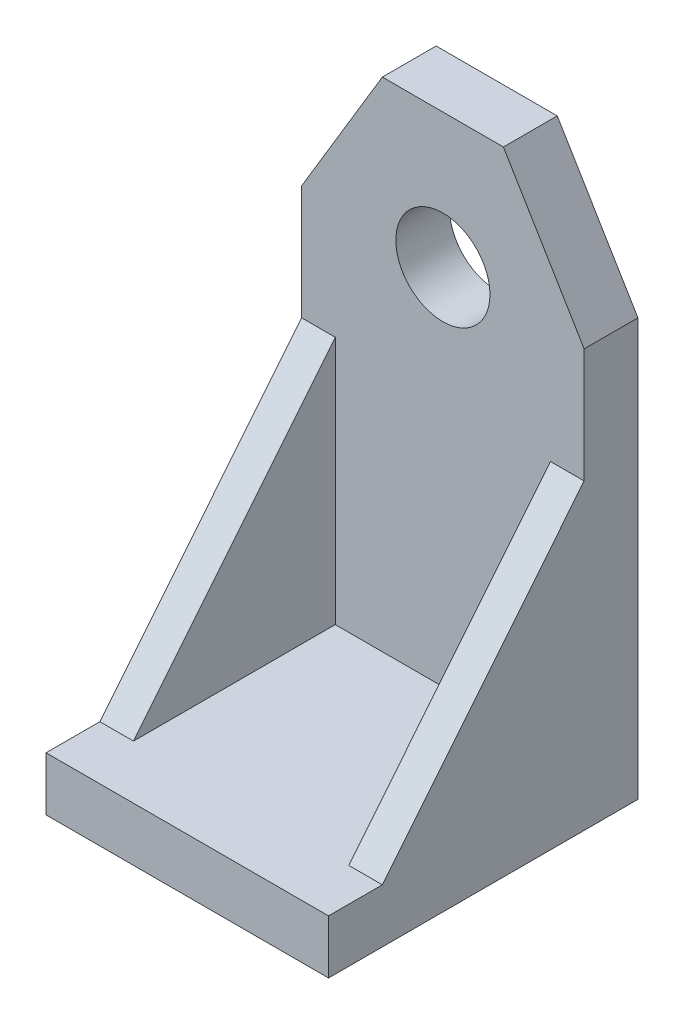
ISO-10303-21;
HEADER;
FILE_DESCRIPTION(('STEP AP214'),'2;1');
FILE_NAME('part.step','',(''),(''),'','','');
FILE_SCHEMA(('AUTOMOTIVE_DESIGN { 1 0 10303 214 1 1 1 1 }'));
ENDSEC;
DATA;
#1=APPLICATION_CONTEXT('core data for automotive mechanical design processes');
#2=APPLICATION_PROTOCOL_DEFINITION('international standard','automotive_design',2000,#1);
#3=PRODUCT_CONTEXT('',#1,'mechanical');
#4=PRODUCT('Part','Part','',(#3));
#5=PRODUCT_RELATED_PRODUCT_CATEGORY('part','',(#4));
#6=PRODUCT_DEFINITION_FORMATION('','',#4);
#7=PRODUCT_DEFINITION_CONTEXT('part definition',#1,'design');
#8=PRODUCT_DEFINITION('design','',#6,#7);
#9=PRODUCT_DEFINITION_SHAPE('','',#8);
#10=(LENGTH_UNIT() NAMED_UNIT(*) SI_UNIT(.MILLI.,.METRE.));
#11=(NAMED_UNIT(*) PLANE_ANGLE_UNIT() SI_UNIT($,.RADIAN.));
#12=(NAMED_UNIT(*) SI_UNIT($,.STERADIAN.) SOLID_ANGLE_UNIT());
#13=UNCERTAINTY_MEASURE_WITH_UNIT(LENGTH_MEASURE(1.E-05),#10,'distance_accuracy_value','');
#14=(GEOMETRIC_REPRESENTATION_CONTEXT(3) GLOBAL_UNCERTAINTY_ASSIGNED_CONTEXT((#13)) GLOBAL_UNIT_ASSIGNED_CONTEXT((#10,
#11,#12)) REPRESENTATION_CONTEXT('',''));
#15=CARTESIAN_POINT('',(0.,0.,0.));
#16=DIRECTION('',(0.,0.,1.));
#17=DIRECTION('',(1.,0.,0.));
#18=AXIS2_PLACEMENT_3D('',#15,#16,#17);
#19=CARTESIAN_POINT('',(0.,8.,23.));
#20=DIRECTION('',(0.,-1.,0.));
#21=DIRECTION('',(0.,0.,-1.));
#22=AXIS2_PLACEMENT_3D('',#19,#20,#21);
#23=PLANE('',#22);
#24=DIRECTION('',(0.,0.,-1.));
#25=VECTOR('',#24,1.);
#26=CARTESIAN_POINT('',(42.,8.,23.));
#27=LINE('',#26,#25);
#28=CARTESIAN_POINT('',(42.,8.,23.));
#29=VERTEX_POINT('',#28);
#30=CARTESIAN_POINT('',(42.,8.,15.));
#31=VERTEX_POINT('',#30);
#32=EDGE_CURVE('E167',#29,#31,#27,.T.);
#33=ORIENTED_EDGE('',*,*,#32,.T.);
#34=DIRECTION('',(1.,0.,0.));
#35=VECTOR('',#34,1.);
#36=CARTESIAN_POINT('',(37.,8.,15.));
#37=LINE('',#36,#35);
#38=CARTESIAN_POINT('',(37.,8.,15.));
#39=VERTEX_POINT('',#38);
#40=EDGE_CURVE('E54',#39,#31,#37,.T.);
#41=ORIENTED_EDGE('',*,*,#40,.F.);
#42=DIRECTION('',(0.,0.,-1.));
#43=VECTOR('',#42,1.);
#44=CARTESIAN_POINT('',(37.,8.,15.));
#45=LINE('',#44,#43);
#46=CARTESIAN_POINT('',(37.,8.,-15.));
#47=VERTEX_POINT('',#46);
#48=EDGE_CURVE('E274',#39,#47,#45,.T.);
#49=ORIENTED_EDGE('',*,*,#48,.T.);
#50=DIRECTION('',(1.,0.,0.));
#51=VECTOR('',#50,1.);
#52=CARTESIAN_POINT('',(42.,8.,-15.));
#53=LINE('',#52,#51);
#54=CARTESIAN_POINT('',(5.00000000000001,8.,-15.));
#55=VERTEX_POINT('',#54);
#56=EDGE_CURVE('E194',#55,#47,#53,.T.);
#57=ORIENTED_EDGE('',*,*,#56,.F.);
#58=DIRECTION('',(0.,0.,-1.));
#59=VECTOR('',#58,1.);
#60=CARTESIAN_POINT('',(5.,8.,15.));
#61=LINE('',#60,#59);
#62=CARTESIAN_POINT('',(5.,8.,15.));
#63=VERTEX_POINT('',#62);
#64=EDGE_CURVE('E288',#63,#55,#61,.T.);
#65=ORIENTED_EDGE('',*,*,#64,.F.);
#66=DIRECTION('',(-1.,0.,0.));
#67=VECTOR('',#66,1.);
#68=CARTESIAN_POINT('',(5.,8.,15.));
#69=LINE('',#68,#67);
#70=CARTESIAN_POINT('',(0.,8.,15.));
#71=VERTEX_POINT('',#70);
#72=EDGE_CURVE('E207',#63,#71,#69,.T.);
#73=ORIENTED_EDGE('',*,*,#72,.T.);
#74=DIRECTION('',(0.,0.,-1.));
#75=VECTOR('',#74,1.);
#76=CARTESIAN_POINT('',(0.,8.,23.));
#77=LINE('',#76,#75);
#78=CARTESIAN_POINT('',(0.,8.,23.));
#79=VERTEX_POINT('',#78);
#80=EDGE_CURVE('E164',#79,#71,#77,.T.);
#81=ORIENTED_EDGE('',*,*,#80,.F.);
#82=DIRECTION('',(-1.,0.,0.));
#83=VECTOR('',#82,1.);
#84=CARTESIAN_POINT('',(0.,8.,23.));
#85=LINE('',#84,#83);
#86=EDGE_CURVE('E158',#29,#79,#85,.T.);
#87=ORIENTED_EDGE('',*,*,#86,.F.);
#88=EDGE_LOOP('',(#33,#41,#49,#57,#65,#73,#81,#87));
#89=FACE_BOUND('',#88,.T.);
#90=ADVANCED_FACE('F39',(#89),#23,.F.);
#91=CARTESIAN_POINT('',(42.,82.,-15.));
#92=DIRECTION('',(0.,0.,-1.));
#93=DIRECTION('',(-1.,0.,0.));
#94=AXIS2_PLACEMENT_3D('',#91,#92,#93);
#95=PLANE('',#94);
#96=CARTESIAN_POINT('',(21.,62.,-15.));
#97=DIRECTION('',(0.,0.,1.));
#98=DIRECTION('',(1.,0.,0.));
#99=AXIS2_PLACEMENT_3D('',#96,#97,#98);
#100=CIRCLE('',#99,7.);
#101=CARTESIAN_POINT('',(28.,62.,-15.));
#102=VERTEX_POINT('',#101);
#103=EDGE_CURVE('E266',#102,#102,#100,.T.);
#104=ORIENTED_EDGE('',*,*,#103,.F.);
#105=EDGE_LOOP('',(#104));
#106=FACE_BOUND('',#105,.T.);
#107=DIRECTION('',(0.,1.,0.));
#108=VECTOR('',#107,1.);
#109=CARTESIAN_POINT('',(37.,8.,-15.));
#110=LINE('',#109,#108);
#111=CARTESIAN_POINT('',(37.,45.,-15.));
#112=VERTEX_POINT('',#111);
#113=EDGE_CURVE('E62',#47,#112,#110,.T.);
#114=ORIENTED_EDGE('',*,*,#113,.T.);
#115=DIRECTION('',(1.,0.,0.));
#116=VECTOR('',#115,1.);
#117=CARTESIAN_POINT('',(37.,45.,-15.));
#118=LINE('',#117,#116);
#119=CARTESIAN_POINT('',(42.,45.0000000000001,-15.));
#120=VERTEX_POINT('',#119);
#121=EDGE_CURVE('E276',#112,#120,#118,.T.);
#122=ORIENTED_EDGE('',*,*,#121,.T.);
#123=DIRECTION('',(0.,-1.,0.));
#124=VECTOR('',#123,1.);
#125=CARTESIAN_POINT('',(42.,82.,-15.));
#126=LINE('',#125,#124);
#127=CARTESIAN_POINT('',(42.,62.,-15.));
#128=VERTEX_POINT('',#127);
#129=EDGE_CURVE('E155',#128,#120,#126,.T.);
#130=ORIENTED_EDGE('',*,*,#129,.F.);
#131=DIRECTION('',(0.514495755427527,-0.857492925712544,0.));
#132=VECTOR('',#131,1.);
#133=CARTESIAN_POINT('',(42.,62.,-15.));
#134=LINE('',#133,#132);
#135=CARTESIAN_POINT('',(30.,82.,-15.));
#136=VERTEX_POINT('',#135);
#137=EDGE_CURVE('E183',#136,#128,#134,.T.);
#138=ORIENTED_EDGE('',*,*,#137,.F.);
#139=DIRECTION('',(1.,0.,0.));
#140=VECTOR('',#139,1.);
#141=CARTESIAN_POINT('',(42.,82.,-15.));
#142=LINE('',#141,#140);
#143=CARTESIAN_POINT('',(12.,82.,-15.));
#144=VERTEX_POINT('',#143);
#145=EDGE_CURVE('E191',#144,#136,#142,.T.);
#146=ORIENTED_EDGE('',*,*,#145,.F.);
#147=DIRECTION('',(0.514495755427527,0.857492925712544,0.));
#148=VECTOR('',#147,1.);
#149=CARTESIAN_POINT('',(12.,82.,-15.));
#150=LINE('',#149,#148);
#151=CARTESIAN_POINT('',(0.,62.,-15.));
#152=VERTEX_POINT('',#151);
#153=EDGE_CURVE('E139',#152,#144,#150,.T.);
#154=ORIENTED_EDGE('',*,*,#153,.F.);
#155=DIRECTION('',(0.,-1.,0.));
#156=VECTOR('',#155,1.);
#157=CARTESIAN_POINT('',(0.,82.,-15.));
#158=LINE('',#157,#156);
#159=CARTESIAN_POINT('',(0.,45.,-15.));
#160=VERTEX_POINT('',#159);
#161=EDGE_CURVE('E147',#152,#160,#158,.T.);
#162=ORIENTED_EDGE('',*,*,#161,.T.);
#163=DIRECTION('',(-1.,0.,0.));
#164=VECTOR('',#163,1.);
#165=CARTESIAN_POINT('',(5.,45.,-15.));
#166=LINE('',#165,#164);
#167=CARTESIAN_POINT('',(5.,45.,-15.));
#168=VERTEX_POINT('',#167);
#169=EDGE_CURVE('E293',#168,#160,#166,.T.);
#170=ORIENTED_EDGE('',*,*,#169,.F.);
#171=DIRECTION('',(0.,1.,0.));
#172=VECTOR('',#171,1.);
#173=CARTESIAN_POINT('',(5.,8.,-15.));
#174=LINE('',#173,#172);
#175=EDGE_CURVE('E282',#55,#168,#174,.T.);
#176=ORIENTED_EDGE('',*,*,#175,.F.);
#177=ORIENTED_EDGE('',*,*,#56,.T.);
#178=EDGE_LOOP('',(#114,#122,#130,#138,#146,#154,#162,#170,#176,#177));
#179=FACE_BOUND('',#178,.T.);
#180=ADVANCED_FACE('F216',(#106,#179),#95,.F.);
#181=CARTESIAN_POINT('',(0.,0.,23.));
#182=DIRECTION('',(1.,0.,0.));
#183=DIRECTION('',(0.,0.,-1.));
#184=AXIS2_PLACEMENT_3D('',#181,#182,#183);
#185=PLANE('',#184);
#186=ORIENTED_EDGE('',*,*,#161,.F.);
#187=DIRECTION('',(0.,0.,1.));
#188=VECTOR('',#187,1.);
#189=CARTESIAN_POINT('',(0.,62.,-23.));
#190=LINE('',#189,#188);
#191=CARTESIAN_POINT('',(0.,62.,-23.));
#192=VERTEX_POINT('',#191);
#193=EDGE_CURVE('E131',#192,#152,#190,.T.);
#194=ORIENTED_EDGE('',*,*,#193,.F.);
#195=DIRECTION('',(0.,-1.,0.));
#196=VECTOR('',#195,1.);
#197=CARTESIAN_POINT('',(0.,0.,-23.));
#198=LINE('',#197,#196);
#199=CARTESIAN_POINT('',(0.,0.,-23.));
#200=VERTEX_POINT('',#199);
#201=EDGE_CURVE('E144',#192,#200,#198,.T.);
#202=ORIENTED_EDGE('',*,*,#201,.T.);
#203=DIRECTION('',(0.,0.,-1.));
#204=VECTOR('',#203,1.);
#205=CARTESIAN_POINT('',(0.,0.,23.));
#206=LINE('',#205,#204);
#207=CARTESIAN_POINT('',(0.,0.,23.));
#208=VERTEX_POINT('',#207);
#209=EDGE_CURVE('E11',#208,#200,#206,.T.);
#210=ORIENTED_EDGE('',*,*,#209,.F.);
#211=DIRECTION('',(0.,-1.,0.));
#212=VECTOR('',#211,1.);
#213=CARTESIAN_POINT('',(0.,0.,23.));
#214=LINE('',#213,#212);
#215=EDGE_CURVE('E163',#79,#208,#214,.T.);
#216=ORIENTED_EDGE('',*,*,#215,.F.);
#217=ORIENTED_EDGE('',*,*,#80,.T.);
#218=DIRECTION('',(0.,-0.776755748719504,0.629801958421219));
#219=VECTOR('',#218,1.);
#220=CARTESIAN_POINT('',(0.,45.,-15.));
#221=LINE('',#220,#219);
#222=EDGE_CURVE('E280',#160,#71,#221,.T.);
#223=ORIENTED_EDGE('',*,*,#222,.F.);
#224=EDGE_LOOP('',(#186,#194,#202,#210,#216,#217,#223));
#225=FACE_BOUND('',#224,.T.);
#226=ADVANCED_FACE('F41',(#225),#185,.F.);
#227=CARTESIAN_POINT('',(0.,0.,23.));
#228=DIRECTION('',(0.,1.,0.));
#229=DIRECTION('',(0.,0.,1.));
#230=AXIS2_PLACEMENT_3D('',#227,#228,#229);
#231=PLANE('',#230);
#232=DIRECTION('',(1.,0.,0.));
#233=VECTOR('',#232,1.);
#234=CARTESIAN_POINT('',(0.,0.,-23.));
#235=LINE('',#234,#233);
#236=CARTESIAN_POINT('',(42.,0.,-23.));
#237=VERTEX_POINT('',#236);
#238=EDGE_CURVE('E151',#200,#237,#235,.T.);
#239=ORIENTED_EDGE('',*,*,#238,.T.);
#240=DIRECTION('',(0.,0.,-1.));
#241=VECTOR('',#240,1.);
#242=CARTESIAN_POINT('',(42.,0.,23.));
#243=LINE('',#242,#241);
#244=CARTESIAN_POINT('',(42.,0.,23.));
#245=VERTEX_POINT('',#244);
#246=EDGE_CURVE('E47',#245,#237,#243,.T.);
#247=ORIENTED_EDGE('',*,*,#246,.F.);
#248=DIRECTION('',(1.,0.,0.));
#249=VECTOR('',#248,1.);
#250=CARTESIAN_POINT('',(0.,0.,23.));
#251=LINE('',#250,#249);
#252=EDGE_CURVE('E200',#208,#245,#251,.T.);
#253=ORIENTED_EDGE('',*,*,#252,.F.);
#254=ORIENTED_EDGE('',*,*,#209,.T.);
#255=EDGE_LOOP('',(#239,#247,#253,#254));
#256=FACE_BOUND('',#255,.T.);
#257=ADVANCED_FACE('F209',(#256),#231,.F.);
#258=CARTESIAN_POINT('',(42.,0.,23.));
#259=DIRECTION('',(-1.,0.,0.));
#260=DIRECTION('',(0.,0.,1.));
#261=AXIS2_PLACEMENT_3D('',#258,#259,#260);
#262=PLANE('',#261);
#263=ORIENTED_EDGE('',*,*,#129,.T.);
#264=DIRECTION('',(0.,-0.776755748719504,0.629801958421219));
#265=VECTOR('',#264,1.);
#266=CARTESIAN_POINT('',(42.,45.,-15.));
#267=LINE('',#266,#265);
#268=EDGE_CURVE('E268',#120,#31,#267,.T.);
#269=ORIENTED_EDGE('',*,*,#268,.T.);
#270=ORIENTED_EDGE('',*,*,#32,.F.);
#271=DIRECTION('',(0.,1.,0.));
#272=VECTOR('',#271,1.);
#273=CARTESIAN_POINT('',(42.,0.,23.));
#274=LINE('',#273,#272);
#275=EDGE_CURVE('E176',#245,#29,#274,.T.);
#276=ORIENTED_EDGE('',*,*,#275,.F.);
#277=ORIENTED_EDGE('',*,*,#246,.T.);
#278=DIRECTION('',(0.,1.,0.));
#279=VECTOR('',#278,1.);
#280=CARTESIAN_POINT('',(42.,0.,-23.));
#281=LINE('',#280,#279);
#282=CARTESIAN_POINT('',(42.,62.,-23.));
#283=VERTEX_POINT('',#282);
#284=EDGE_CURVE('E153',#237,#283,#281,.T.);
#285=ORIENTED_EDGE('',*,*,#284,.T.);
#286=DIRECTION('',(0.,0.,1.));
#287=VECTOR('',#286,1.);
#288=CARTESIAN_POINT('',(42.,62.,-23.));
#289=LINE('',#288,#287);
#290=EDGE_CURVE('E184',#283,#128,#289,.T.);
#291=ORIENTED_EDGE('',*,*,#290,.T.);
#292=EDGE_LOOP('',(#263,#269,#270,#276,#277,#285,#291));
#293=FACE_BOUND('',#292,.T.);
#294=ADVANCED_FACE('F173',(#293),#262,.F.);
#295=CARTESIAN_POINT('',(0.,0.,23.));
#296=DIRECTION('',(0.,0.,-1.));
#297=DIRECTION('',(-1.,0.,0.));
#298=AXIS2_PLACEMENT_3D('',#295,#296,#297);
#299=PLANE('',#298);
#300=ORIENTED_EDGE('',*,*,#215,.T.);
#301=ORIENTED_EDGE('',*,*,#252,.T.);
#302=ORIENTED_EDGE('',*,*,#275,.T.);
#303=ORIENTED_EDGE('',*,*,#86,.T.);
#304=EDGE_LOOP('',(#300,#301,#302,#303));
#305=FACE_BOUND('',#304,.T.);
#306=ADVANCED_FACE('F204',(#305),#299,.F.);
#307=CARTESIAN_POINT('',(0.,0.,-23.));
#308=DIRECTION('',(0.,0.,-1.));
#309=DIRECTION('',(-1.,0.,0.));
#310=AXIS2_PLACEMENT_3D('',#307,#308,#309);
#311=PLANE('',#310);
#312=CARTESIAN_POINT('',(21.,62.,-23.));
#313=DIRECTION('',(0.,0.,1.));
#314=DIRECTION('',(1.,0.,0.));
#315=AXIS2_PLACEMENT_3D('',#312,#313,#314);
#316=CIRCLE('',#315,7.);
#317=CARTESIAN_POINT('',(28.,62.,-23.));
#318=VERTEX_POINT('',#317);
#319=EDGE_CURVE('E263',#318,#318,#316,.T.);
#320=ORIENTED_EDGE('',*,*,#319,.T.);
#321=EDGE_LOOP('',(#320));
#322=FACE_BOUND('',#321,.T.);
#323=DIRECTION('',(0.514495755427527,0.857492925712544,0.));
#324=VECTOR('',#323,1.);
#325=CARTESIAN_POINT('',(12.,82.,-23.));
#326=LINE('',#325,#324);
#327=CARTESIAN_POINT('',(12.,82.,-23.));
#328=VERTEX_POINT('',#327);
#329=EDGE_CURVE('E128',#192,#328,#326,.T.);
#330=ORIENTED_EDGE('',*,*,#329,.T.);
#331=DIRECTION('',(-1.,0.,0.));
#332=VECTOR('',#331,1.);
#333=CARTESIAN_POINT('',(0.,82.,-23.));
#334=LINE('',#333,#332);
#335=CARTESIAN_POINT('',(30.,82.,-23.));
#336=VERTEX_POINT('',#335);
#337=EDGE_CURVE('E180',#336,#328,#334,.T.);
#338=ORIENTED_EDGE('',*,*,#337,.F.);
#339=DIRECTION('',(0.514495755427527,-0.857492925712544,0.));
#340=VECTOR('',#339,1.);
#341=CARTESIAN_POINT('',(42.,62.,-23.));
#342=LINE('',#341,#340);
#343=EDGE_CURVE('E179',#336,#283,#342,.T.);
#344=ORIENTED_EDGE('',*,*,#343,.T.);
#345=ORIENTED_EDGE('',*,*,#284,.F.);
#346=ORIENTED_EDGE('',*,*,#238,.F.);
#347=ORIENTED_EDGE('',*,*,#201,.F.);
#348=EDGE_LOOP('',(#330,#338,#344,#345,#346,#347));
#349=FACE_BOUND('',#348,.T.);
#350=ADVANCED_FACE('F149',(#322,#349),#311,.T.);
#351=CARTESIAN_POINT('',(0.,82.,0.));
#352=DIRECTION('',(0.,-1.,0.));
#353=DIRECTION('',(0.,0.,-1.));
#354=AXIS2_PLACEMENT_3D('',#351,#352,#353);
#355=PLANE('',#354);
#356=ORIENTED_EDGE('',*,*,#337,.T.);
#357=DIRECTION('',(0.,0.,1.));
#358=VECTOR('',#357,1.);
#359=CARTESIAN_POINT('',(12.,82.,-23.));
#360=LINE('',#359,#358);
#361=EDGE_CURVE('E134',#328,#144,#360,.T.);
#362=ORIENTED_EDGE('',*,*,#361,.T.);
#363=ORIENTED_EDGE('',*,*,#145,.T.);
#364=DIRECTION('',(0.,0.,1.));
#365=VECTOR('',#364,1.);
#366=CARTESIAN_POINT('',(30.,82.,-23.));
#367=LINE('',#366,#365);
#368=EDGE_CURVE('E187',#336,#136,#367,.T.);
#369=ORIENTED_EDGE('',*,*,#368,.F.);
#370=EDGE_LOOP('',(#356,#362,#363,#369));
#371=FACE_BOUND('',#370,.T.);
#372=ADVANCED_FACE('F227',(#371),#355,.F.);
#373=CARTESIAN_POINT('',(42.,62.,-23.));
#374=DIRECTION('',(-0.857492925712544,-0.514495755427527,0.));
#375=DIRECTION('',(0.514495755427527,-0.857492925712544,0.));
#376=AXIS2_PLACEMENT_3D('',#373,#374,#375);
#377=PLANE('',#376);
#378=ORIENTED_EDGE('',*,*,#137,.T.);
#379=ORIENTED_EDGE('',*,*,#290,.F.);
#380=ORIENTED_EDGE('',*,*,#343,.F.);
#381=ORIENTED_EDGE('',*,*,#368,.T.);
#382=EDGE_LOOP('',(#378,#379,#380,#381));
#383=FACE_BOUND('',#382,.T.);
#384=ADVANCED_FACE('F233',(#383),#377,.F.);
#385=CARTESIAN_POINT('',(12.,82.,-23.));
#386=DIRECTION('',(0.857492925712544,-0.514495755427527,0.));
#387=DIRECTION('',(0.514495755427527,0.857492925712544,0.));
#388=AXIS2_PLACEMENT_3D('',#385,#386,#387);
#389=PLANE('',#388);
#390=ORIENTED_EDGE('',*,*,#153,.T.);
#391=ORIENTED_EDGE('',*,*,#361,.F.);
#392=ORIENTED_EDGE('',*,*,#329,.F.);
#393=ORIENTED_EDGE('',*,*,#193,.T.);
#394=EDGE_LOOP('',(#390,#391,#392,#393));
#395=FACE_BOUND('',#394,.T.);
#396=ADVANCED_FACE('F130',(#395),#389,.F.);
#397=CARTESIAN_POINT('',(5.,45.,-15.));
#398=DIRECTION('',(0.,-0.629801958421219,-0.776755748719504));
#399=DIRECTION('',(0.,0.776755748719504,-0.629801958421219));
#400=AXIS2_PLACEMENT_3D('',#397,#398,#399);
#401=PLANE('',#400);
#402=ORIENTED_EDGE('',*,*,#222,.T.);
#403=ORIENTED_EDGE('',*,*,#72,.F.);
#404=DIRECTION('',(0.,-0.776755748719504,0.629801958421219));
#405=VECTOR('',#404,1.);
#406=CARTESIAN_POINT('',(5.,45.,-15.));
#407=LINE('',#406,#405);
#408=EDGE_CURVE('E285',#168,#63,#407,.T.);
#409=ORIENTED_EDGE('',*,*,#408,.F.);
#410=ORIENTED_EDGE('',*,*,#169,.T.);
#411=EDGE_LOOP('',(#402,#403,#409,#410));
#412=FACE_BOUND('',#411,.T.);
#413=ADVANCED_FACE('F239',(#412),#401,.F.);
#414=CARTESIAN_POINT('',(5.,0.,0.));
#415=DIRECTION('',(-1.,0.,0.));
#416=DIRECTION('',(0.,0.,1.));
#417=AXIS2_PLACEMENT_3D('',#414,#415,#416);
#418=PLANE('',#417);
#419=ORIENTED_EDGE('',*,*,#175,.T.);
#420=ORIENTED_EDGE('',*,*,#408,.T.);
#421=ORIENTED_EDGE('',*,*,#64,.T.);
#422=EDGE_LOOP('',(#419,#420,#421));
#423=FACE_BOUND('',#422,.T.);
#424=ADVANCED_FACE('F242',(#423),#418,.F.);
#425=CARTESIAN_POINT('',(37.,45.,-15.));
#426=DIRECTION('',(0.,0.629801958421219,0.776755748719504));
#427=DIRECTION('',(0.,-0.776755748719504,0.629801958421219));
#428=AXIS2_PLACEMENT_3D('',#425,#426,#427);
#429=PLANE('',#428);
#430=ORIENTED_EDGE('',*,*,#268,.F.);
#431=ORIENTED_EDGE('',*,*,#121,.F.);
#432=DIRECTION('',(0.,-0.776755748719504,0.629801958421219));
#433=VECTOR('',#432,1.);
#434=CARTESIAN_POINT('',(37.,45.,-15.));
#435=LINE('',#434,#433);
#436=EDGE_CURVE('E272',#112,#39,#435,.T.);
#437=ORIENTED_EDGE('',*,*,#436,.T.);
#438=ORIENTED_EDGE('',*,*,#40,.T.);
#439=EDGE_LOOP('',(#430,#431,#437,#438));
#440=FACE_BOUND('',#439,.T.);
#441=ADVANCED_FACE('F246',(#440),#429,.T.);
#442=CARTESIAN_POINT('',(37.,0.,0.));
#443=DIRECTION('',(-1.,0.,0.));
#444=DIRECTION('',(0.,0.,1.));
#445=AXIS2_PLACEMENT_3D('',#442,#443,#444);
#446=PLANE('',#445);
#447=ORIENTED_EDGE('',*,*,#113,.F.);
#448=ORIENTED_EDGE('',*,*,#48,.F.);
#449=ORIENTED_EDGE('',*,*,#436,.F.);
#450=EDGE_LOOP('',(#447,#448,#449));
#451=FACE_BOUND('',#450,.T.);
#452=ADVANCED_FACE('F250',(#451),#446,.T.);
#453=CARTESIAN_POINT('',(21.,62.,-23.));
#454=DIRECTION('',(0.,0.,1.));
#455=DIRECTION('',(1.,0.,0.));
#456=AXIS2_PLACEMENT_3D('',#453,#454,#455);
#457=CYLINDRICAL_SURFACE('',#456,7.);
#458=ORIENTED_EDGE('',*,*,#319,.F.);
#459=EDGE_LOOP('',(#458));
#460=FACE_BOUND('',#459,.T.);
#461=ORIENTED_EDGE('',*,*,#103,.T.);
#462=EDGE_LOOP('',(#461));
#463=FACE_BOUND('',#462,.T.);
#464=ADVANCED_FACE('F254',(#460,#463),#457,.F.);
#465=CLOSED_SHELL('',(#90,#180,#226,#257,#294,#306,#350,#372,#384,#396,#413,#424,#441,#452,#464));
#466=MANIFOLD_SOLID_BREP('B2',#465);
#467=ADVANCED_BREP_SHAPE_REPRESENTATION('',(#18,#466),#14);
#468=SHAPE_DEFINITION_REPRESENTATION(#9,#467);
ENDSEC;
END-ISO-10303-21;
